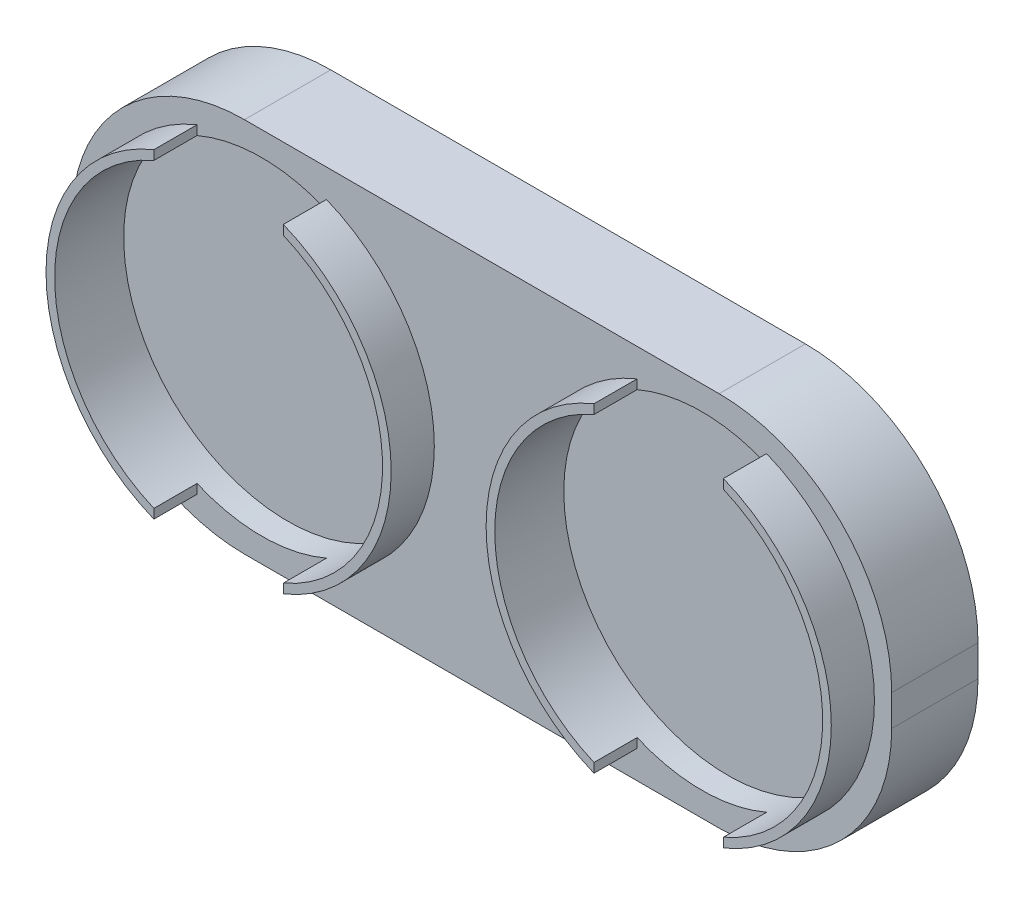
ISO-10303-21;
HEADER;
FILE_DESCRIPTION(('STEP AP214'),'2;1');
FILE_NAME('part.step','',(''),(''),'','','');
FILE_SCHEMA(('AUTOMOTIVE_DESIGN { 1 0 10303 214 1 1 1 1 }'));
ENDSEC;
DATA;
#1=APPLICATION_CONTEXT('core data for automotive mechanical design processes');
#2=APPLICATION_PROTOCOL_DEFINITION('international standard','automotive_design',2000,#1);
#3=PRODUCT_CONTEXT('',#1,'mechanical');
#4=PRODUCT('Part','Part','',(#3));
#5=PRODUCT_RELATED_PRODUCT_CATEGORY('part','',(#4));
#6=PRODUCT_DEFINITION_FORMATION('','',#4);
#7=PRODUCT_DEFINITION_CONTEXT('part definition',#1,'design');
#8=PRODUCT_DEFINITION('design','',#6,#7);
#9=PRODUCT_DEFINITION_SHAPE('','',#8);
#10=(LENGTH_UNIT() NAMED_UNIT(*) SI_UNIT(.MILLI.,.METRE.));
#11=(NAMED_UNIT(*) PLANE_ANGLE_UNIT() SI_UNIT($,.RADIAN.));
#12=(NAMED_UNIT(*) SI_UNIT($,.STERADIAN.) SOLID_ANGLE_UNIT());
#13=UNCERTAINTY_MEASURE_WITH_UNIT(LENGTH_MEASURE(1.E-05),#10,'distance_accuracy_value','');
#14=(GEOMETRIC_REPRESENTATION_CONTEXT(3) GLOBAL_UNCERTAINTY_ASSIGNED_CONTEXT((#13)) GLOBAL_UNIT_ASSIGNED_CONTEXT((#10,
#11,#12)) REPRESENTATION_CONTEXT('',''));
#15=CARTESIAN_POINT('',(0.,0.,0.));
#16=DIRECTION('',(0.,0.,1.));
#17=DIRECTION('',(1.,0.,0.));
#18=AXIS2_PLACEMENT_3D('',#15,#16,#17);
#19=CARTESIAN_POINT('',(0.,0.,0.));
#20=DIRECTION('',(0.,0.,-1.));
#21=DIRECTION('',(-1.,0.,0.));
#22=AXIS2_PLACEMENT_3D('',#19,#20,#21);
#23=PLANE('',#22);
#24=CARTESIAN_POINT('',(-24.87,-12.45,0.));
#25=DIRECTION('',(0.,0.,-1.));
#26=DIRECTION('',(-1.,0.,0.));
#27=AXIS2_PLACEMENT_3D('',#24,#25,#26);
#28=CIRCLE('',#27,3.9);
#29=CARTESIAN_POINT('',(-28.77,-12.45,0.));
#30=VERTEX_POINT('',#29);
#31=EDGE_CURVE('E937',#30,#30,#28,.T.);
#32=ORIENTED_EDGE('',*,*,#31,.F.);
#33=EDGE_LOOP('',(#32));
#34=FACE_BOUND('',#33,.T.);
#35=CARTESIAN_POINT('',(24.87,-12.45,0.));
#36=DIRECTION('',(0.,0.,-1.));
#37=DIRECTION('',(-1.,0.,0.));
#38=AXIS2_PLACEMENT_3D('',#35,#36,#37);
#39=CIRCLE('',#38,3.9);
#40=CARTESIAN_POINT('',(20.97,-12.45,0.));
#41=VERTEX_POINT('',#40);
#42=EDGE_CURVE('E928',#41,#41,#39,.T.);
#43=ORIENTED_EDGE('',*,*,#42,.F.);
#44=EDGE_LOOP('',(#43));
#45=FACE_BOUND('',#44,.T.);
#46=CARTESIAN_POINT('',(0.,12.45,0.));
#47=DIRECTION('',(0.,0.,-1.));
#48=DIRECTION('',(-1.,0.,0.));
#49=AXIS2_PLACEMENT_3D('',#46,#47,#48);
#50=CIRCLE('',#49,3.9);
#51=CARTESIAN_POINT('',(-3.9,12.45,0.));
#52=VERTEX_POINT('',#51);
#53=EDGE_CURVE('E271',#52,#52,#50,.F.);
#54=ORIENTED_EDGE('',*,*,#53,.T.);
#55=EDGE_LOOP('',(#54));
#56=FACE_BOUND('',#55,.T.);
#57=DIRECTION('',(0.,-1.,0.));
#58=VECTOR('',#57,1.);
#59=CARTESIAN_POINT('',(-47.5,-21.8,0.));
#60=LINE('',#59,#58);
#61=CARTESIAN_POINT('',(-47.5,1.8,0.));
#62=VERTEX_POINT('',#61);
#63=CARTESIAN_POINT('',(-47.5,-1.8,0.));
#64=VERTEX_POINT('',#63);
#65=EDGE_CURVE('E288',#62,#64,#60,.T.);
#66=ORIENTED_EDGE('',*,*,#65,.F.);
#67=CARTESIAN_POINT('',(-27.5,1.8,0.));
#68=DIRECTION('',(0.,0.,-1.));
#69=DIRECTION('',(-1.,0.,0.));
#70=AXIS2_PLACEMENT_3D('',#67,#68,#69);
#71=CIRCLE('',#70,20.);
#72=CARTESIAN_POINT('',(-27.5,21.8,0.));
#73=VERTEX_POINT('',#72);
#74=EDGE_CURVE('E310',#62,#73,#71,.T.);
#75=ORIENTED_EDGE('',*,*,#74,.T.);
#76=DIRECTION('',(-1.,0.,0.));
#77=VECTOR('',#76,1.);
#78=CARTESIAN_POINT('',(47.5,21.8,0.));
#79=LINE('',#78,#77);
#80=CARTESIAN_POINT('',(27.5,21.8,0.));
#81=VERTEX_POINT('',#80);
#82=EDGE_CURVE('E277',#81,#73,#79,.T.);
#83=ORIENTED_EDGE('',*,*,#82,.F.);
#84=CARTESIAN_POINT('',(27.5,1.8,0.));
#85=DIRECTION('',(0.,0.,-1.));
#86=DIRECTION('',(-1.,0.,0.));
#87=AXIS2_PLACEMENT_3D('',#84,#85,#86);
#88=CIRCLE('',#87,20.);
#89=CARTESIAN_POINT('',(47.5,1.8,0.));
#90=VERTEX_POINT('',#89);
#91=EDGE_CURVE('E301',#81,#90,#88,.T.);
#92=ORIENTED_EDGE('',*,*,#91,.T.);
#93=DIRECTION('',(0.,1.,0.));
#94=VECTOR('',#93,1.);
#95=CARTESIAN_POINT('',(47.5,-21.8,0.));
#96=LINE('',#95,#94);
#97=CARTESIAN_POINT('',(47.5,-1.8,0.));
#98=VERTEX_POINT('',#97);
#99=EDGE_CURVE('E282',#98,#90,#96,.T.);
#100=ORIENTED_EDGE('',*,*,#99,.F.);
#101=CARTESIAN_POINT('',(27.5,-1.8,0.));
#102=DIRECTION('',(0.,0.,-1.));
#103=DIRECTION('',(-1.,0.,0.));
#104=AXIS2_PLACEMENT_3D('',#101,#102,#103);
#105=CIRCLE('',#104,20.);
#106=CARTESIAN_POINT('',(27.5,-21.8,0.));
#107=VERTEX_POINT('',#106);
#108=EDGE_CURVE('E303',#98,#107,#105,.T.);
#109=ORIENTED_EDGE('',*,*,#108,.T.);
#110=DIRECTION('',(1.,0.,0.));
#111=VECTOR('',#110,1.);
#112=CARTESIAN_POINT('',(47.5,-21.8,0.));
#113=LINE('',#112,#111);
#114=CARTESIAN_POINT('',(-27.5,-21.8,0.));
#115=VERTEX_POINT('',#114);
#116=EDGE_CURVE('E292',#115,#107,#113,.T.);
#117=ORIENTED_EDGE('',*,*,#116,.F.);
#118=CARTESIAN_POINT('',(-27.5,-1.8,0.));
#119=DIRECTION('',(0.,0.,-1.));
#120=DIRECTION('',(-1.,0.,0.));
#121=AXIS2_PLACEMENT_3D('',#118,#119,#120);
#122=CIRCLE('',#121,20.);
#123=EDGE_CURVE('E304',#115,#64,#122,.T.);
#124=ORIENTED_EDGE('',*,*,#123,.T.);
#125=EDGE_LOOP('',(#66,#75,#83,#92,#100,#109,#117,#124));
#126=FACE_BOUND('',#125,.T.);
#127=CARTESIAN_POINT('',(0.,-12.45,0.));
#128=DIRECTION('',(0.,0.,-1.));
#129=DIRECTION('',(-1.,0.,0.));
#130=AXIS2_PLACEMENT_3D('',#127,#128,#129);
#131=CIRCLE('',#130,3.9);
#132=CARTESIAN_POINT('',(-3.9,-12.45,0.));
#133=VERTEX_POINT('',#132);
#134=EDGE_CURVE('E258',#133,#133,#131,.T.);
#135=ORIENTED_EDGE('',*,*,#134,.F.);
#136=EDGE_LOOP('',(#135));
#137=FACE_BOUND('',#136,.T.);
#138=CARTESIAN_POINT('',(-24.87,12.45,0.));
#139=DIRECTION('',(0.,0.,-1.));
#140=DIRECTION('',(-1.,0.,0.));
#141=AXIS2_PLACEMENT_3D('',#138,#139,#140);
#142=CIRCLE('',#141,3.9);
#143=CARTESIAN_POINT('',(-28.77,12.45,0.));
#144=VERTEX_POINT('',#143);
#145=EDGE_CURVE('E328',#144,#144,#142,.T.);
#146=ORIENTED_EDGE('',*,*,#145,.F.);
#147=EDGE_LOOP('',(#146));
#148=FACE_BOUND('',#147,.T.);
#149=CARTESIAN_POINT('',(24.87,12.45,0.));
#150=DIRECTION('',(0.,0.,-1.));
#151=DIRECTION('',(-1.,0.,0.));
#152=AXIS2_PLACEMENT_3D('',#149,#150,#151);
#153=CIRCLE('',#152,3.9);
#154=CARTESIAN_POINT('',(20.97,12.45,0.));
#155=VERTEX_POINT('',#154);
#156=EDGE_CURVE('E332',#155,#155,#153,.T.);
#157=ORIENTED_EDGE('',*,*,#156,.F.);
#158=EDGE_LOOP('',(#157));
#159=FACE_BOUND('',#158,.T.);
#160=ADVANCED_FACE('F43',(#34,#45,#56,#126,#137,#148,#159),#23,.T.);
#161=CARTESIAN_POINT('',(0.,0.,10.));
#162=DIRECTION('',(0.,0.,-1.));
#163=DIRECTION('',(-1.,0.,0.));
#164=AXIS2_PLACEMENT_3D('',#161,#162,#163);
#165=PLANE('',#164);
#166=CARTESIAN_POINT('',(25.5,0.,10.));
#167=DIRECTION('',(0.,0.,1.));
#168=DIRECTION('',(-1.,0.,0.));
#169=AXIS2_PLACEMENT_3D('',#166,#167,#168);
#170=CIRCLE('',#169,19.);
#171=CARTESIAN_POINT('',(18.,-17.4570902500961,10.));
#172=VERTEX_POINT('',#171);
#173=CARTESIAN_POINT('',(33.,-17.4570902500961,10.));
#174=VERTEX_POINT('',#173);
#175=EDGE_CURVE('E207',#172,#174,#170,.T.);
#176=ORIENTED_EDGE('',*,*,#175,.F.);
#177=DIRECTION('',(0.,-1.,0.));
#178=VECTOR('',#177,1.);
#179=CARTESIAN_POINT('',(18.,-21.8,10.));
#180=LINE('',#179,#178);
#181=CARTESIAN_POINT('',(18.,-18.5404962177391,10.));
#182=VERTEX_POINT('',#181);
#183=EDGE_CURVE('E208',#172,#182,#180,.T.);
#184=ORIENTED_EDGE('',*,*,#183,.T.);
#185=CARTESIAN_POINT('',(25.5,0.,10.));
#186=DIRECTION('',(0.,0.,1.));
#187=DIRECTION('',(1.,0.,0.));
#188=AXIS2_PLACEMENT_3D('',#185,#186,#187);
#189=CIRCLE('',#188,20.);
#190=CARTESIAN_POINT('',(18.,18.5404962177392,10.));
#191=VERTEX_POINT('',#190);
#192=EDGE_CURVE('E263',#182,#191,#189,.F.);
#193=ORIENTED_EDGE('',*,*,#192,.T.);
#194=CARTESIAN_POINT('',(18.,17.4570902500961,10.));
#195=VERTEX_POINT('',#194);
#196=EDGE_CURVE('E227',#191,#195,#180,.T.);
#197=ORIENTED_EDGE('',*,*,#196,.T.);
#198=CARTESIAN_POINT('',(33.,17.4570902500961,10.));
#199=VERTEX_POINT('',#198);
#200=EDGE_CURVE('E216',#199,#195,#170,.T.);
#201=ORIENTED_EDGE('',*,*,#200,.F.);
#202=DIRECTION('',(0.,1.,0.));
#203=VECTOR('',#202,1.);
#204=CARTESIAN_POINT('',(33.,-21.8,10.));
#205=LINE('',#204,#203);
#206=CARTESIAN_POINT('',(33.,18.5404962177392,10.));
#207=VERTEX_POINT('',#206);
#208=EDGE_CURVE('E909',#199,#207,#205,.T.);
#209=ORIENTED_EDGE('',*,*,#208,.T.);
#210=CARTESIAN_POINT('',(33.,-18.5404962177392,10.));
#211=VERTEX_POINT('',#210);
#212=EDGE_CURVE('E250',#207,#211,#189,.F.);
#213=ORIENTED_EDGE('',*,*,#212,.T.);
#214=EDGE_CURVE('E214',#211,#174,#205,.T.);
#215=ORIENTED_EDGE('',*,*,#214,.T.);
#216=EDGE_LOOP('',(#176,#184,#193,#197,#201,#209,#213,#215));
#217=FACE_BOUND('',#216,.T.);
#218=DIRECTION('',(-1.,0.,0.));
#219=VECTOR('',#218,1.);
#220=CARTESIAN_POINT('',(47.5,21.8,10.));
#221=LINE('',#220,#219);
#222=CARTESIAN_POINT('',(27.5,21.8,10.));
#223=VERTEX_POINT('',#222);
#224=CARTESIAN_POINT('',(-27.5,21.8,10.));
#225=VERTEX_POINT('',#224);
#226=EDGE_CURVE('E280',#223,#225,#221,.T.);
#227=ORIENTED_EDGE('',*,*,#226,.T.);
#228=CARTESIAN_POINT('',(-27.5,1.8,10.));
#229=DIRECTION('',(0.,0.,-1.));
#230=DIRECTION('',(-1.,0.,0.));
#231=AXIS2_PLACEMENT_3D('',#228,#229,#230);
#232=CIRCLE('',#231,20.);
#233=CARTESIAN_POINT('',(-47.5,1.8,10.));
#234=VERTEX_POINT('',#233);
#235=EDGE_CURVE('E316',#225,#234,#232,.F.);
#236=ORIENTED_EDGE('',*,*,#235,.T.);
#237=DIRECTION('',(0.,-1.,0.));
#238=VECTOR('',#237,1.);
#239=CARTESIAN_POINT('',(-47.5,-21.8,10.));
#240=LINE('',#239,#238);
#241=CARTESIAN_POINT('',(-47.5,-1.8,10.));
#242=VERTEX_POINT('',#241);
#243=EDGE_CURVE('E278',#234,#242,#240,.T.);
#244=ORIENTED_EDGE('',*,*,#243,.T.);
#245=CARTESIAN_POINT('',(-27.5,-1.8,10.));
#246=DIRECTION('',(0.,0.,-1.));
#247=DIRECTION('',(-1.,0.,0.));
#248=AXIS2_PLACEMENT_3D('',#245,#246,#247);
#249=CIRCLE('',#248,20.);
#250=CARTESIAN_POINT('',(-27.5,-21.8,10.));
#251=VERTEX_POINT('',#250);
#252=EDGE_CURVE('E320',#242,#251,#249,.F.);
#253=ORIENTED_EDGE('',*,*,#252,.T.);
#254=DIRECTION('',(1.,0.,0.));
#255=VECTOR('',#254,1.);
#256=CARTESIAN_POINT('',(47.5,-21.8,10.));
#257=LINE('',#256,#255);
#258=CARTESIAN_POINT('',(27.5,-21.8,10.));
#259=VERTEX_POINT('',#258);
#260=EDGE_CURVE('E281',#251,#259,#257,.T.);
#261=ORIENTED_EDGE('',*,*,#260,.T.);
#262=CARTESIAN_POINT('',(27.5,-1.8,10.));
#263=DIRECTION('',(0.,0.,-1.));
#264=DIRECTION('',(-1.,0.,0.));
#265=AXIS2_PLACEMENT_3D('',#262,#263,#264);
#266=CIRCLE('',#265,20.);
#267=CARTESIAN_POINT('',(47.5,-1.8,10.));
#268=VERTEX_POINT('',#267);
#269=EDGE_CURVE('E63',#259,#268,#266,.F.);
#270=ORIENTED_EDGE('',*,*,#269,.T.);
#271=DIRECTION('',(0.,1.,0.));
#272=VECTOR('',#271,1.);
#273=CARTESIAN_POINT('',(47.5,-21.8,10.));
#274=LINE('',#273,#272);
#275=CARTESIAN_POINT('',(47.5,1.8,10.));
#276=VERTEX_POINT('',#275);
#277=EDGE_CURVE('E275',#268,#276,#274,.T.);
#278=ORIENTED_EDGE('',*,*,#277,.T.);
#279=CARTESIAN_POINT('',(27.5,1.8,10.));
#280=DIRECTION('',(0.,0.,-1.));
#281=DIRECTION('',(-1.,0.,0.));
#282=AXIS2_PLACEMENT_3D('',#279,#280,#281);
#283=CIRCLE('',#282,20.);
#284=EDGE_CURVE('E313',#276,#223,#283,.F.);
#285=ORIENTED_EDGE('',*,*,#284,.T.);
#286=EDGE_LOOP('',(#227,#236,#244,#253,#261,#270,#278,#285));
#287=FACE_BOUND('',#286,.T.);
#288=CARTESIAN_POINT('',(-25.5,0.,10.));
#289=DIRECTION('',(0.,0.,1.));
#290=DIRECTION('',(1.,0.,0.));
#291=AXIS2_PLACEMENT_3D('',#288,#289,#290);
#292=CIRCLE('',#291,19.);
#293=CARTESIAN_POINT('',(-18.,17.4570902500961,10.));
#294=VERTEX_POINT('',#293);
#295=CARTESIAN_POINT('',(-33.,17.4570902500961,10.));
#296=VERTEX_POINT('',#295);
#297=EDGE_CURVE('E934',#294,#296,#292,.T.);
#298=ORIENTED_EDGE('',*,*,#297,.F.);
#299=DIRECTION('',(0.,1.,0.));
#300=VECTOR('',#299,1.);
#301=CARTESIAN_POINT('',(-18.,-21.8,10.));
#302=LINE('',#301,#300);
#303=CARTESIAN_POINT('',(-18.,18.5404962177392,10.));
#304=VERTEX_POINT('',#303);
#305=EDGE_CURVE('E885',#294,#304,#302,.T.);
#306=ORIENTED_EDGE('',*,*,#305,.T.);
#307=CARTESIAN_POINT('',(-25.5,0.,10.));
#308=DIRECTION('',(0.,0.,1.));
#309=DIRECTION('',(1.,0.,0.));
#310=AXIS2_PLACEMENT_3D('',#307,#308,#309);
#311=CIRCLE('',#310,20.);
#312=CARTESIAN_POINT('',(-18.,-18.5404962177392,10.));
#313=VERTEX_POINT('',#312);
#314=EDGE_CURVE('E257',#313,#304,#311,.T.);
#315=ORIENTED_EDGE('',*,*,#314,.F.);
#316=CARTESIAN_POINT('',(-18.,-17.4570902500961,10.));
#317=VERTEX_POINT('',#316);
#318=EDGE_CURVE('E877',#313,#317,#302,.T.);
#319=ORIENTED_EDGE('',*,*,#318,.T.);
#320=CARTESIAN_POINT('',(-33.,-17.4570902500961,10.));
#321=VERTEX_POINT('',#320);
#322=EDGE_CURVE('E220',#321,#317,#292,.T.);
#323=ORIENTED_EDGE('',*,*,#322,.F.);
#324=DIRECTION('',(0.,-1.,0.));
#325=VECTOR('',#324,1.);
#326=CARTESIAN_POINT('',(-33.,-21.8,10.));
#327=LINE('',#326,#325);
#328=CARTESIAN_POINT('',(-33.,-18.5404962177392,10.));
#329=VERTEX_POINT('',#328);
#330=EDGE_CURVE('E925',#321,#329,#327,.T.);
#331=ORIENTED_EDGE('',*,*,#330,.T.);
#332=CARTESIAN_POINT('',(-33.,18.5404962177392,10.));
#333=VERTEX_POINT('',#332);
#334=EDGE_CURVE('E256',#333,#329,#311,.T.);
#335=ORIENTED_EDGE('',*,*,#334,.F.);
#336=EDGE_CURVE('E924',#333,#296,#327,.T.);
#337=ORIENTED_EDGE('',*,*,#336,.T.);
#338=EDGE_LOOP('',(#298,#306,#315,#319,#323,#331,#335,#337));
#339=FACE_BOUND('',#338,.T.);
#340=ADVANCED_FACE('F206',(#217,#287,#339),#165,.F.);
#341=CARTESIAN_POINT('',(25.5,0.,15.));
#342=DIRECTION('',(0.,0.,-1.));
#343=DIRECTION('',(-1.,0.,0.));
#344=AXIS2_PLACEMENT_3D('',#341,#342,#343);
#345=CYLINDRICAL_SURFACE('',#344,20.);
#346=DIRECTION('',(0.,0.,-1.));
#347=VECTOR('',#346,1.);
#348=CARTESIAN_POINT('',(18.,18.5404962177392,15.));
#349=LINE('',#348,#347);
#350=CARTESIAN_POINT('',(18.,18.5404962177392,15.));
#351=VERTEX_POINT('',#350);
#352=EDGE_CURVE('E244',#191,#351,#349,.F.);
#353=ORIENTED_EDGE('',*,*,#352,.F.);
#354=ORIENTED_EDGE('',*,*,#192,.F.);
#355=DIRECTION('',(0.,0.,-1.));
#356=VECTOR('',#355,1.);
#357=CARTESIAN_POINT('',(18.,-18.5404962177391,15.));
#358=LINE('',#357,#356);
#359=CARTESIAN_POINT('',(18.,-18.5404962177391,15.));
#360=VERTEX_POINT('',#359);
#361=EDGE_CURVE('E228',#360,#182,#358,.T.);
#362=ORIENTED_EDGE('',*,*,#361,.F.);
#363=CARTESIAN_POINT('',(25.5,0.,15.));
#364=DIRECTION('',(0.,0.,1.));
#365=DIRECTION('',(1.,0.,0.));
#366=AXIS2_PLACEMENT_3D('',#363,#364,#365);
#367=CIRCLE('',#366,20.);
#368=EDGE_CURVE('E261',#360,#351,#367,.F.);
#369=ORIENTED_EDGE('',*,*,#368,.T.);
#370=EDGE_LOOP('',(#353,#354,#362,#369));
#371=FACE_BOUND('',#370,.T.);
#372=ADVANCED_FACE('F390',(#371),#345,.T.);
#373=CARTESIAN_POINT('',(0.,0.,15.));
#374=DIRECTION('',(0.,0.,1.));
#375=DIRECTION('',(1.,0.,0.));
#376=AXIS2_PLACEMENT_3D('',#373,#374,#375);
#377=PLANE('',#376);
#378=DIRECTION('',(0.,1.,0.));
#379=VECTOR('',#378,1.);
#380=CARTESIAN_POINT('',(33.,-21.8,15.));
#381=LINE('',#380,#379);
#382=CARTESIAN_POINT('',(33.,-18.5404962177392,15.));
#383=VERTEX_POINT('',#382);
#384=CARTESIAN_POINT('',(33.,-17.4570902500961,15.));
#385=VERTEX_POINT('',#384);
#386=EDGE_CURVE('E917',#383,#385,#381,.T.);
#387=ORIENTED_EDGE('',*,*,#386,.F.);
#388=CARTESIAN_POINT('',(33.,18.5404962177392,15.));
#389=VERTEX_POINT('',#388);
#390=EDGE_CURVE('E262',#389,#383,#367,.F.);
#391=ORIENTED_EDGE('',*,*,#390,.F.);
#392=CARTESIAN_POINT('',(33.,17.4570902500961,15.));
#393=VERTEX_POINT('',#392);
#394=EDGE_CURVE('E908',#393,#389,#381,.T.);
#395=ORIENTED_EDGE('',*,*,#394,.F.);
#396=CARTESIAN_POINT('',(25.5,0.,15.));
#397=DIRECTION('',(0.,0.,1.));
#398=DIRECTION('',(1.,0.,0.));
#399=AXIS2_PLACEMENT_3D('',#396,#397,#398);
#400=CIRCLE('',#399,19.);
#401=EDGE_CURVE('E266',#393,#385,#400,.F.);
#402=ORIENTED_EDGE('',*,*,#401,.T.);
#403=EDGE_LOOP('',(#387,#391,#395,#402));
#404=FACE_BOUND('',#403,.T.);
#405=ADVANCED_FACE('F513',(#404),#377,.T.);
#406=CARTESIAN_POINT('',(-25.5,0.,15.));
#407=DIRECTION('',(0.,0.,-1.));
#408=DIRECTION('',(-1.,0.,0.));
#409=AXIS2_PLACEMENT_3D('',#406,#407,#408);
#410=CYLINDRICAL_SURFACE('',#409,20.);
#411=CARTESIAN_POINT('',(-25.5,0.,15.));
#412=DIRECTION('',(0.,0.,1.));
#413=DIRECTION('',(1.,0.,0.));
#414=AXIS2_PLACEMENT_3D('',#411,#412,#413);
#415=CIRCLE('',#414,20.);
#416=CARTESIAN_POINT('',(-33.,18.5404962177392,15.));
#417=VERTEX_POINT('',#416);
#418=CARTESIAN_POINT('',(-33.,-18.5404962177392,15.));
#419=VERTEX_POINT('',#418);
#420=EDGE_CURVE('E253',#417,#419,#415,.T.);
#421=ORIENTED_EDGE('',*,*,#420,.F.);
#422=DIRECTION('',(0.,0.,-1.));
#423=VECTOR('',#422,1.);
#424=CARTESIAN_POINT('',(-33.,18.5404962177392,15.));
#425=LINE('',#424,#423);
#426=EDGE_CURVE('E892',#417,#333,#425,.T.);
#427=ORIENTED_EDGE('',*,*,#426,.T.);
#428=ORIENTED_EDGE('',*,*,#334,.T.);
#429=DIRECTION('',(0.,0.,-1.));
#430=VECTOR('',#429,1.);
#431=CARTESIAN_POINT('',(-33.,-18.5404962177392,15.));
#432=LINE('',#431,#430);
#433=EDGE_CURVE('E891',#329,#419,#432,.F.);
#434=ORIENTED_EDGE('',*,*,#433,.T.);
#435=EDGE_LOOP('',(#421,#427,#428,#434));
#436=FACE_BOUND('',#435,.T.);
#437=ADVANCED_FACE('F510',(#436),#410,.T.);
#438=CARTESIAN_POINT('',(0.,0.,15.));
#439=DIRECTION('',(0.,0.,1.));
#440=DIRECTION('',(1.,0.,0.));
#441=AXIS2_PLACEMENT_3D('',#438,#439,#440);
#442=PLANE('',#441);
#443=DIRECTION('',(0.,1.,0.));
#444=VECTOR('',#443,1.);
#445=CARTESIAN_POINT('',(-18.,-21.8,15.));
#446=LINE('',#445,#444);
#447=CARTESIAN_POINT('',(-18.,-18.5404962177392,15.));
#448=VERTEX_POINT('',#447);
#449=CARTESIAN_POINT('',(-18.,-17.4570902500961,15.));
#450=VERTEX_POINT('',#449);
#451=EDGE_CURVE('E865',#448,#450,#446,.T.);
#452=ORIENTED_EDGE('',*,*,#451,.F.);
#453=CARTESIAN_POINT('',(-18.,18.5404962177392,15.));
#454=VERTEX_POINT('',#453);
#455=EDGE_CURVE('E255',#448,#454,#415,.T.);
#456=ORIENTED_EDGE('',*,*,#455,.T.);
#457=CARTESIAN_POINT('',(-18.,17.4570902500961,15.));
#458=VERTEX_POINT('',#457);
#459=EDGE_CURVE('E870',#458,#454,#446,.T.);
#460=ORIENTED_EDGE('',*,*,#459,.F.);
#461=CARTESIAN_POINT('',(-25.5,0.,15.));
#462=DIRECTION('',(0.,0.,1.));
#463=DIRECTION('',(1.,0.,0.));
#464=AXIS2_PLACEMENT_3D('',#461,#462,#463);
#465=CIRCLE('',#464,19.);
#466=EDGE_CURVE('E247',#450,#458,#465,.T.);
#467=ORIENTED_EDGE('',*,*,#466,.F.);
#468=EDGE_LOOP('',(#452,#456,#460,#467));
#469=FACE_BOUND('',#468,.T.);
#470=ADVANCED_FACE('F409',(#469),#442,.T.);
#471=CARTESIAN_POINT('',(47.5,21.8,10.));
#472=DIRECTION('',(0.,-1.,0.));
#473=DIRECTION('',(0.,0.,-1.));
#474=AXIS2_PLACEMENT_3D('',#471,#472,#473);
#475=PLANE('',#474);
#476=ORIENTED_EDGE('',*,*,#82,.T.);
#477=DIRECTION('',(0.,0.,-1.));
#478=VECTOR('',#477,1.);
#479=CARTESIAN_POINT('',(-27.5,21.8,10.));
#480=LINE('',#479,#478);
#481=EDGE_CURVE('E315',#73,#225,#480,.F.);
#482=ORIENTED_EDGE('',*,*,#481,.T.);
#483=ORIENTED_EDGE('',*,*,#226,.F.);
#484=DIRECTION('',(0.,0.,-1.));
#485=VECTOR('',#484,1.);
#486=CARTESIAN_POINT('',(27.5,21.8,10.));
#487=LINE('',#486,#485);
#488=EDGE_CURVE('E307',#223,#81,#487,.T.);
#489=ORIENTED_EDGE('',*,*,#488,.T.);
#490=EDGE_LOOP('',(#476,#482,#483,#489));
#491=FACE_BOUND('',#490,.T.);
#492=ADVANCED_FACE('F404',(#491),#475,.F.);
#493=CARTESIAN_POINT('',(-47.5,-21.8,10.));
#494=DIRECTION('',(1.,0.,0.));
#495=DIRECTION('',(0.,0.,-1.));
#496=AXIS2_PLACEMENT_3D('',#493,#494,#495);
#497=PLANE('',#496);
#498=ORIENTED_EDGE('',*,*,#243,.F.);
#499=DIRECTION('',(0.,0.,-1.));
#500=VECTOR('',#499,1.);
#501=CARTESIAN_POINT('',(-47.5,1.8,10.));
#502=LINE('',#501,#500);
#503=EDGE_CURVE('E296',#234,#62,#502,.T.);
#504=ORIENTED_EDGE('',*,*,#503,.T.);
#505=ORIENTED_EDGE('',*,*,#65,.T.);
#506=DIRECTION('',(0.,0.,-1.));
#507=VECTOR('',#506,1.);
#508=CARTESIAN_POINT('',(-47.5,-1.8,10.));
#509=LINE('',#508,#507);
#510=EDGE_CURVE('E298',#64,#242,#509,.F.);
#511=ORIENTED_EDGE('',*,*,#510,.T.);
#512=EDGE_LOOP('',(#498,#504,#505,#511));
#513=FACE_BOUND('',#512,.T.);
#514=ADVANCED_FACE('F399',(#513),#497,.F.);
#515=CARTESIAN_POINT('',(47.5,-21.8,10.));
#516=DIRECTION('',(0.,1.,0.));
#517=DIRECTION('',(0.,0.,1.));
#518=AXIS2_PLACEMENT_3D('',#515,#516,#517);
#519=PLANE('',#518);
#520=ORIENTED_EDGE('',*,*,#260,.F.);
#521=DIRECTION('',(0.,0.,-1.));
#522=VECTOR('',#521,1.);
#523=CARTESIAN_POINT('',(-27.5,-21.8,10.));
#524=LINE('',#523,#522);
#525=EDGE_CURVE('E324',#251,#115,#524,.T.);
#526=ORIENTED_EDGE('',*,*,#525,.T.);
#527=ORIENTED_EDGE('',*,*,#116,.T.);
#528=DIRECTION('',(0.,0.,-1.));
#529=VECTOR('',#528,1.);
#530=CARTESIAN_POINT('',(27.5,-21.8,10.));
#531=LINE('',#530,#529);
#532=EDGE_CURVE('E322',#107,#259,#531,.F.);
#533=ORIENTED_EDGE('',*,*,#532,.T.);
#534=EDGE_LOOP('',(#520,#526,#527,#533));
#535=FACE_BOUND('',#534,.T.);
#536=ADVANCED_FACE('F400',(#535),#519,.F.);
#537=CARTESIAN_POINT('',(47.5,-21.8,10.));
#538=DIRECTION('',(-1.,0.,0.));
#539=DIRECTION('',(0.,0.,1.));
#540=AXIS2_PLACEMENT_3D('',#537,#538,#539);
#541=PLANE('',#540);
#542=ORIENTED_EDGE('',*,*,#277,.F.);
#543=DIRECTION('',(0.,0.,-1.));
#544=VECTOR('',#543,1.);
#545=CARTESIAN_POINT('',(47.5,-1.8,10.));
#546=LINE('',#545,#544);
#547=EDGE_CURVE('E329',#268,#98,#546,.T.);
#548=ORIENTED_EDGE('',*,*,#547,.T.);
#549=ORIENTED_EDGE('',*,*,#99,.T.);
#550=DIRECTION('',(0.,0.,-1.));
#551=VECTOR('',#550,1.);
#552=CARTESIAN_POINT('',(47.5,1.8,10.));
#553=LINE('',#552,#551);
#554=EDGE_CURVE('E59',#90,#276,#553,.F.);
#555=ORIENTED_EDGE('',*,*,#554,.T.);
#556=EDGE_LOOP('',(#542,#548,#549,#555));
#557=FACE_BOUND('',#556,.T.);
#558=ADVANCED_FACE('F395',(#557),#541,.F.);
#559=CARTESIAN_POINT('',(0.,12.45,-4.));
#560=DIRECTION('',(0.,0.,1.));
#561=DIRECTION('',(1.,0.,0.));
#562=AXIS2_PLACEMENT_3D('',#559,#560,#561);
#563=CYLINDRICAL_SURFACE('',#562,3.9);
#564=CARTESIAN_POINT('',(0.,12.45,-3.6));
#565=DIRECTION('',(0.,0.,-1.));
#566=DIRECTION('',(-1.,0.,0.));
#567=AXIS2_PLACEMENT_3D('',#564,#565,#566);
#568=CIRCLE('',#567,3.9);
#569=CARTESIAN_POINT('',(-3.9,12.45,-3.6));
#570=VERTEX_POINT('',#569);
#571=EDGE_CURVE('E359',#570,#570,#568,.F.);
#572=ORIENTED_EDGE('',*,*,#571,.T.);
#573=EDGE_LOOP('',(#572));
#574=FACE_BOUND('',#573,.T.);
#575=ORIENTED_EDGE('',*,*,#53,.F.);
#576=EDGE_LOOP('',(#575));
#577=FACE_BOUND('',#576,.T.);
#578=ADVANCED_FACE('F396',(#574,#577),#563,.T.);
#579=CARTESIAN_POINT('',(0.,0.,-4.));
#580=DIRECTION('',(0.,0.,-1.));
#581=DIRECTION('',(-1.,0.,0.));
#582=AXIS2_PLACEMENT_3D('',#579,#580,#581);
#583=PLANE('',#582);
#584=CARTESIAN_POINT('',(0.,12.45,-4.));
#585=DIRECTION('',(0.,0.,-1.));
#586=DIRECTION('',(-1.,0.,0.));
#587=AXIS2_PLACEMENT_3D('',#584,#585,#586);
#588=CIRCLE('',#587,3.5);
#589=CARTESIAN_POINT('',(-3.5,12.45,-4.));
#590=VERTEX_POINT('',#589);
#591=EDGE_CURVE('E361',#590,#590,#588,.T.);
#592=ORIENTED_EDGE('',*,*,#591,.T.);
#593=EDGE_LOOP('',(#592));
#594=FACE_BOUND('',#593,.T.);
#595=ADVANCED_FACE('F530',(#594),#583,.T.);
#596=CARTESIAN_POINT('',(0.,-12.45,-4.));
#597=DIRECTION('',(0.,0.,1.));
#598=DIRECTION('',(1.,0.,0.));
#599=AXIS2_PLACEMENT_3D('',#596,#597,#598);
#600=CYLINDRICAL_SURFACE('',#599,3.9);
#601=CARTESIAN_POINT('',(0.,-12.45,-3.6));
#602=DIRECTION('',(0.,0.,-1.));
#603=DIRECTION('',(-1.,0.,0.));
#604=AXIS2_PLACEMENT_3D('',#601,#602,#603);
#605=CIRCLE('',#604,3.9);
#606=CARTESIAN_POINT('',(-3.9,-12.45,-3.6));
#607=VERTEX_POINT('',#606);
#608=EDGE_CURVE('E11',#607,#607,#605,.F.);
#609=ORIENTED_EDGE('',*,*,#608,.T.);
#610=EDGE_LOOP('',(#609));
#611=FACE_BOUND('',#610,.T.);
#612=ORIENTED_EDGE('',*,*,#134,.T.);
#613=EDGE_LOOP('',(#612));
#614=FACE_BOUND('',#613,.T.);
#615=ADVANCED_FACE('F521',(#611,#614),#600,.T.);
#616=CARTESIAN_POINT('',(0.,0.,-4.));
#617=DIRECTION('',(0.,0.,-1.));
#618=DIRECTION('',(-1.,0.,0.));
#619=AXIS2_PLACEMENT_3D('',#616,#617,#618);
#620=PLANE('',#619);
#621=CARTESIAN_POINT('',(0.,-12.45,-4.));
#622=DIRECTION('',(0.,0.,-1.));
#623=DIRECTION('',(-1.,0.,0.));
#624=AXIS2_PLACEMENT_3D('',#621,#622,#623);
#625=CIRCLE('',#624,3.5);
#626=CARTESIAN_POINT('',(-3.5,-12.45,-4.));
#627=VERTEX_POINT('',#626);
#628=EDGE_CURVE('E51',#627,#627,#625,.T.);
#629=ORIENTED_EDGE('',*,*,#628,.T.);
#630=EDGE_LOOP('',(#629));
#631=FACE_BOUND('',#630,.T.);
#632=ADVANCED_FACE('F368',(#631),#620,.T.);
#633=DIRECTION('',(0.,0.,-1.));
#634=VECTOR('',#633,1.);
#635=CARTESIAN_POINT('',(33.,-18.5404962177392,15.));
#636=LINE('',#635,#634);
#637=EDGE_CURVE('E240',#211,#383,#636,.F.);
#638=ORIENTED_EDGE('',*,*,#637,.F.);
#639=ORIENTED_EDGE('',*,*,#212,.F.);
#640=DIRECTION('',(0.,0.,-1.));
#641=VECTOR('',#640,1.);
#642=CARTESIAN_POINT('',(33.,18.5404962177392,15.));
#643=LINE('',#642,#641);
#644=EDGE_CURVE('E239',#389,#207,#643,.T.);
#645=ORIENTED_EDGE('',*,*,#644,.F.);
#646=ORIENTED_EDGE('',*,*,#390,.T.);
#647=EDGE_LOOP('',(#638,#639,#645,#646));
#648=FACE_BOUND('',#647,.T.);
#649=ADVANCED_FACE('F519',(#648),#345,.T.);
#650=CARTESIAN_POINT('',(25.5,0.,15.));
#651=DIRECTION('',(0.,0.,-1.));
#652=DIRECTION('',(-1.,0.,0.));
#653=AXIS2_PLACEMENT_3D('',#650,#651,#652);
#654=CYLINDRICAL_SURFACE('',#653,19.);
#655=DIRECTION('',(0.,0.,-1.));
#656=VECTOR('',#655,1.);
#657=CARTESIAN_POINT('',(33.,17.4570902500961,15.));
#658=LINE('',#657,#656);
#659=EDGE_CURVE('E905',#393,#199,#658,.T.);
#660=ORIENTED_EDGE('',*,*,#659,.T.);
#661=ORIENTED_EDGE('',*,*,#200,.T.);
#662=DIRECTION('',(0.,0.,-1.));
#663=VECTOR('',#662,1.);
#664=CARTESIAN_POINT('',(18.,17.4570902500961,15.));
#665=LINE('',#664,#663);
#666=CARTESIAN_POINT('',(18.,17.4570902500961,15.));
#667=VERTEX_POINT('',#666);
#668=EDGE_CURVE('E236',#195,#667,#665,.F.);
#669=ORIENTED_EDGE('',*,*,#668,.T.);
#670=CARTESIAN_POINT('',(18.,-17.4570902500961,15.));
#671=VERTEX_POINT('',#670);
#672=EDGE_CURVE('E232',#671,#667,#400,.F.);
#673=ORIENTED_EDGE('',*,*,#672,.F.);
#674=DIRECTION('',(0.,0.,-1.));
#675=VECTOR('',#674,1.);
#676=CARTESIAN_POINT('',(18.,-17.4570902500961,15.));
#677=LINE('',#676,#675);
#678=EDGE_CURVE('E222',#671,#172,#677,.T.);
#679=ORIENTED_EDGE('',*,*,#678,.T.);
#680=ORIENTED_EDGE('',*,*,#175,.T.);
#681=DIRECTION('',(0.,0.,-1.));
#682=VECTOR('',#681,1.);
#683=CARTESIAN_POINT('',(33.,-17.4570902500961,15.));
#684=LINE('',#683,#682);
#685=EDGE_CURVE('E901',#174,#385,#684,.F.);
#686=ORIENTED_EDGE('',*,*,#685,.T.);
#687=ORIENTED_EDGE('',*,*,#401,.F.);
#688=EDGE_LOOP('',(#660,#661,#669,#673,#679,#680,#686,#687));
#689=FACE_BOUND('',#688,.T.);
#690=CARTESIAN_POINT('',(25.5,0.,7.));
#691=DIRECTION('',(0.,0.,1.));
#692=DIRECTION('',(-1.,0.,0.));
#693=AXIS2_PLACEMENT_3D('',#690,#691,#692);
#694=CIRCLE('',#693,19.);
#695=CARTESIAN_POINT('',(6.5,0.,7.));
#696=VERTEX_POINT('',#695);
#697=EDGE_CURVE('E929',#696,#696,#694,.T.);
#698=ORIENTED_EDGE('',*,*,#697,.F.);
#699=EDGE_LOOP('',(#698));
#700=FACE_BOUND('',#699,.T.);
#701=ADVANCED_FACE('F233',(#689,#700),#654,.F.);
#702=DIRECTION('',(0.,-1.,0.));
#703=VECTOR('',#702,1.);
#704=CARTESIAN_POINT('',(18.,-21.8,15.));
#705=LINE('',#704,#703);
#706=EDGE_CURVE('E919',#351,#667,#705,.T.);
#707=ORIENTED_EDGE('',*,*,#706,.F.);
#708=ORIENTED_EDGE('',*,*,#368,.F.);
#709=EDGE_CURVE('E882',#671,#360,#705,.T.);
#710=ORIENTED_EDGE('',*,*,#709,.F.);
#711=ORIENTED_EDGE('',*,*,#672,.T.);
#712=EDGE_LOOP('',(#707,#708,#710,#711));
#713=FACE_BOUND('',#712,.T.);
#714=ADVANCED_FACE('F509',(#713),#377,.T.);
#715=CARTESIAN_POINT('',(-25.5,0.,15.));
#716=DIRECTION('',(0.,0.,-1.));
#717=DIRECTION('',(-1.,0.,0.));
#718=AXIS2_PLACEMENT_3D('',#715,#716,#717);
#719=CYLINDRICAL_SURFACE('',#718,19.);
#720=DIRECTION('',(0.,0.,-1.));
#721=VECTOR('',#720,1.);
#722=CARTESIAN_POINT('',(-18.,-17.4570902500961,15.));
#723=LINE('',#722,#721);
#724=EDGE_CURVE('E887',#450,#317,#723,.T.);
#725=ORIENTED_EDGE('',*,*,#724,.F.);
#726=ORIENTED_EDGE('',*,*,#466,.T.);
#727=DIRECTION('',(0.,0.,-1.));
#728=VECTOR('',#727,1.);
#729=CARTESIAN_POINT('',(-18.,17.4570902500961,15.));
#730=LINE('',#729,#728);
#731=EDGE_CURVE('E880',#294,#458,#730,.F.);
#732=ORIENTED_EDGE('',*,*,#731,.F.);
#733=ORIENTED_EDGE('',*,*,#297,.T.);
#734=DIRECTION('',(0.,0.,-1.));
#735=VECTOR('',#734,1.);
#736=CARTESIAN_POINT('',(-33.,17.4570902500961,15.));
#737=LINE('',#736,#735);
#738=CARTESIAN_POINT('',(-33.,17.4570902500961,15.));
#739=VERTEX_POINT('',#738);
#740=EDGE_CURVE('E898',#739,#296,#737,.T.);
#741=ORIENTED_EDGE('',*,*,#740,.F.);
#742=CARTESIAN_POINT('',(-33.,-17.4570902500961,15.));
#743=VERTEX_POINT('',#742);
#744=EDGE_CURVE('E252',#739,#743,#465,.T.);
#745=ORIENTED_EDGE('',*,*,#744,.T.);
#746=DIRECTION('',(0.,0.,-1.));
#747=VECTOR('',#746,1.);
#748=CARTESIAN_POINT('',(-33.,-17.4570902500961,15.));
#749=LINE('',#748,#747);
#750=EDGE_CURVE('E900',#321,#743,#749,.F.);
#751=ORIENTED_EDGE('',*,*,#750,.F.);
#752=ORIENTED_EDGE('',*,*,#322,.T.);
#753=EDGE_LOOP('',(#725,#726,#732,#733,#741,#745,#751,#752));
#754=FACE_BOUND('',#753,.T.);
#755=CARTESIAN_POINT('',(-25.5,0.,7.));
#756=DIRECTION('',(0.,0.,1.));
#757=DIRECTION('',(1.,0.,0.));
#758=AXIS2_PLACEMENT_3D('',#755,#756,#757);
#759=CIRCLE('',#758,19.);
#760=CARTESIAN_POINT('',(-6.50000000000001,0.,7.));
#761=VERTEX_POINT('',#760);
#762=EDGE_CURVE('E911',#761,#761,#759,.T.);
#763=ORIENTED_EDGE('',*,*,#762,.F.);
#764=EDGE_LOOP('',(#763));
#765=FACE_BOUND('',#764,.T.);
#766=ADVANCED_FACE('F504',(#754,#765),#719,.F.);
#767=ORIENTED_EDGE('',*,*,#455,.F.);
#768=DIRECTION('',(0.,0.,-1.));
#769=VECTOR('',#768,1.);
#770=CARTESIAN_POINT('',(-18.,-18.5404962177392,15.));
#771=LINE('',#770,#769);
#772=EDGE_CURVE('E875',#448,#313,#771,.T.);
#773=ORIENTED_EDGE('',*,*,#772,.T.);
#774=ORIENTED_EDGE('',*,*,#314,.T.);
#775=DIRECTION('',(0.,0.,-1.));
#776=VECTOR('',#775,1.);
#777=CARTESIAN_POINT('',(-18.,18.5404962177392,15.));
#778=LINE('',#777,#776);
#779=EDGE_CURVE('E873',#304,#454,#778,.F.);
#780=ORIENTED_EDGE('',*,*,#779,.T.);
#781=EDGE_LOOP('',(#767,#773,#774,#780));
#782=FACE_BOUND('',#781,.T.);
#783=ADVANCED_FACE('F501',(#782),#410,.T.);
#784=DIRECTION('',(0.,-1.,0.));
#785=VECTOR('',#784,1.);
#786=CARTESIAN_POINT('',(-33.,-21.8,15.));
#787=LINE('',#786,#785);
#788=EDGE_CURVE('E923',#417,#739,#787,.T.);
#789=ORIENTED_EDGE('',*,*,#788,.F.);
#790=ORIENTED_EDGE('',*,*,#420,.T.);
#791=EDGE_CURVE('E869',#743,#419,#787,.T.);
#792=ORIENTED_EDGE('',*,*,#791,.F.);
#793=ORIENTED_EDGE('',*,*,#744,.F.);
#794=EDGE_LOOP('',(#789,#790,#792,#793));
#795=FACE_BOUND('',#794,.T.);
#796=ADVANCED_FACE('F489',(#795),#442,.T.);
#797=CARTESIAN_POINT('',(-33.,-21.8,-36.108133772687));
#798=DIRECTION('',(-1.,0.,0.));
#799=DIRECTION('',(0.,0.,1.));
#800=AXIS2_PLACEMENT_3D('',#797,#798,#799);
#801=PLANE('',#800);
#802=ORIENTED_EDGE('',*,*,#740,.T.);
#803=ORIENTED_EDGE('',*,*,#336,.F.);
#804=ORIENTED_EDGE('',*,*,#426,.F.);
#805=ORIENTED_EDGE('',*,*,#788,.T.);
#806=EDGE_LOOP('',(#802,#803,#804,#805));
#807=FACE_BOUND('',#806,.T.);
#808=ADVANCED_FACE('F487',(#807),#801,.F.);
#809=CARTESIAN_POINT('',(-18.,-21.8,-36.108133772687));
#810=DIRECTION('',(1.,0.,0.));
#811=DIRECTION('',(0.,1.,0.));
#812=AXIS2_PLACEMENT_3D('',#809,#810,#811);
#813=PLANE('',#812);
#814=ORIENTED_EDGE('',*,*,#731,.T.);
#815=ORIENTED_EDGE('',*,*,#459,.T.);
#816=ORIENTED_EDGE('',*,*,#779,.F.);
#817=ORIENTED_EDGE('',*,*,#305,.F.);
#818=EDGE_LOOP('',(#814,#815,#816,#817));
#819=FACE_BOUND('',#818,.T.);
#820=ADVANCED_FACE('F488',(#819),#813,.F.);
#821=ORIENTED_EDGE('',*,*,#750,.T.);
#822=ORIENTED_EDGE('',*,*,#791,.T.);
#823=ORIENTED_EDGE('',*,*,#433,.F.);
#824=ORIENTED_EDGE('',*,*,#330,.F.);
#825=EDGE_LOOP('',(#821,#822,#823,#824));
#826=FACE_BOUND('',#825,.T.);
#827=ADVANCED_FACE('F483',(#826),#801,.F.);
#828=ORIENTED_EDGE('',*,*,#724,.T.);
#829=ORIENTED_EDGE('',*,*,#318,.F.);
#830=ORIENTED_EDGE('',*,*,#772,.F.);
#831=ORIENTED_EDGE('',*,*,#451,.T.);
#832=EDGE_LOOP('',(#828,#829,#830,#831));
#833=FACE_BOUND('',#832,.T.);
#834=ADVANCED_FACE('F478',(#833),#813,.F.);
#835=CARTESIAN_POINT('',(33.,-21.8,-36.108133772687));
#836=DIRECTION('',(1.,0.,0.));
#837=DIRECTION('',(0.,0.,-1.));
#838=AXIS2_PLACEMENT_3D('',#835,#836,#837);
#839=PLANE('',#838);
#840=ORIENTED_EDGE('',*,*,#644,.T.);
#841=ORIENTED_EDGE('',*,*,#208,.F.);
#842=ORIENTED_EDGE('',*,*,#659,.F.);
#843=ORIENTED_EDGE('',*,*,#394,.T.);
#844=EDGE_LOOP('',(#840,#841,#842,#843));
#845=FACE_BOUND('',#844,.T.);
#846=ADVANCED_FACE('F482',(#845),#839,.F.);
#847=CARTESIAN_POINT('',(18.,-21.8,-36.108133772687));
#848=DIRECTION('',(-1.,0.,0.));
#849=DIRECTION('',(0.,-1.,0.));
#850=AXIS2_PLACEMENT_3D('',#847,#848,#849);
#851=PLANE('',#850);
#852=ORIENTED_EDGE('',*,*,#352,.T.);
#853=ORIENTED_EDGE('',*,*,#706,.T.);
#854=ORIENTED_EDGE('',*,*,#668,.F.);
#855=ORIENTED_EDGE('',*,*,#196,.F.);
#856=EDGE_LOOP('',(#852,#853,#854,#855));
#857=FACE_BOUND('',#856,.T.);
#858=ADVANCED_FACE('F495',(#857),#851,.F.);
#859=ORIENTED_EDGE('',*,*,#361,.T.);
#860=ORIENTED_EDGE('',*,*,#183,.F.);
#861=ORIENTED_EDGE('',*,*,#678,.F.);
#862=ORIENTED_EDGE('',*,*,#709,.T.);
#863=EDGE_LOOP('',(#859,#860,#861,#862));
#864=FACE_BOUND('',#863,.T.);
#865=ADVANCED_FACE('F225',(#864),#851,.F.);
#866=ORIENTED_EDGE('',*,*,#637,.T.);
#867=ORIENTED_EDGE('',*,*,#386,.T.);
#868=ORIENTED_EDGE('',*,*,#685,.F.);
#869=ORIENTED_EDGE('',*,*,#214,.F.);
#870=EDGE_LOOP('',(#866,#867,#868,#869));
#871=FACE_BOUND('',#870,.T.);
#872=ADVANCED_FACE('F411',(#871),#839,.F.);
#873=CARTESIAN_POINT('',(-27.5,1.8,10.));
#874=DIRECTION('',(0.,0.,-1.));
#875=DIRECTION('',(-1.,0.,0.));
#876=AXIS2_PLACEMENT_3D('',#873,#874,#875);
#877=CYLINDRICAL_SURFACE('',#876,20.);
#878=ORIENTED_EDGE('',*,*,#235,.F.);
#879=ORIENTED_EDGE('',*,*,#481,.F.);
#880=ORIENTED_EDGE('',*,*,#74,.F.);
#881=ORIENTED_EDGE('',*,*,#503,.F.);
#882=EDGE_LOOP('',(#878,#879,#880,#881));
#883=FACE_BOUND('',#882,.T.);
#884=ADVANCED_FACE('F408',(#883),#877,.T.);
#885=CARTESIAN_POINT('',(-27.5,-1.8,10.));
#886=DIRECTION('',(0.,0.,-1.));
#887=DIRECTION('',(-1.,0.,0.));
#888=AXIS2_PLACEMENT_3D('',#885,#886,#887);
#889=CYLINDRICAL_SURFACE('',#888,20.);
#890=ORIENTED_EDGE('',*,*,#252,.F.);
#891=ORIENTED_EDGE('',*,*,#510,.F.);
#892=ORIENTED_EDGE('',*,*,#123,.F.);
#893=ORIENTED_EDGE('',*,*,#525,.F.);
#894=EDGE_LOOP('',(#890,#891,#892,#893));
#895=FACE_BOUND('',#894,.T.);
#896=ADVANCED_FACE('F415',(#895),#889,.T.);
#897=CARTESIAN_POINT('',(27.5,-1.8,10.));
#898=DIRECTION('',(0.,0.,-1.));
#899=DIRECTION('',(-1.,0.,0.));
#900=AXIS2_PLACEMENT_3D('',#897,#898,#899);
#901=CYLINDRICAL_SURFACE('',#900,20.);
#902=ORIENTED_EDGE('',*,*,#269,.F.);
#903=ORIENTED_EDGE('',*,*,#532,.F.);
#904=ORIENTED_EDGE('',*,*,#108,.F.);
#905=ORIENTED_EDGE('',*,*,#547,.F.);
#906=EDGE_LOOP('',(#902,#903,#904,#905));
#907=FACE_BOUND('',#906,.T.);
#908=ADVANCED_FACE('F417',(#907),#901,.T.);
#909=CARTESIAN_POINT('',(27.5,1.8,10.));
#910=DIRECTION('',(0.,0.,-1.));
#911=DIRECTION('',(-1.,0.,0.));
#912=AXIS2_PLACEMENT_3D('',#909,#910,#911);
#913=CYLINDRICAL_SURFACE('',#912,20.);
#914=ORIENTED_EDGE('',*,*,#284,.F.);
#915=ORIENTED_EDGE('',*,*,#554,.F.);
#916=ORIENTED_EDGE('',*,*,#91,.F.);
#917=ORIENTED_EDGE('',*,*,#488,.F.);
#918=EDGE_LOOP('',(#914,#915,#916,#917));
#919=FACE_BOUND('',#918,.T.);
#920=ADVANCED_FACE('F422',(#919),#913,.T.);
#921=CARTESIAN_POINT('',(25.5,0.,7.));
#922=DIRECTION('',(0.,0.,-1.));
#923=DIRECTION('',(-1.,0.,0.));
#924=AXIS2_PLACEMENT_3D('',#921,#922,#923);
#925=PLANE('',#924);
#926=ORIENTED_EDGE('',*,*,#697,.T.);
#927=EDGE_LOOP('',(#926));
#928=FACE_BOUND('',#927,.T.);
#929=ADVANCED_FACE('F428',(#928),#925,.F.);
#930=CARTESIAN_POINT('',(-25.5,0.,7.));
#931=DIRECTION('',(0.,0.,1.));
#932=DIRECTION('',(1.,0.,0.));
#933=AXIS2_PLACEMENT_3D('',#930,#931,#932);
#934=PLANE('',#933);
#935=ORIENTED_EDGE('',*,*,#762,.T.);
#936=EDGE_LOOP('',(#935));
#937=FACE_BOUND('',#936,.T.);
#938=ADVANCED_FACE('F474',(#937),#934,.T.);
#939=CARTESIAN_POINT('',(24.87,-12.45,-4.));
#940=DIRECTION('',(0.,0.,1.));
#941=DIRECTION('',(1.,0.,0.));
#942=AXIS2_PLACEMENT_3D('',#939,#940,#941);
#943=CYLINDRICAL_SURFACE('',#942,3.9);
#944=CARTESIAN_POINT('',(24.87,-12.45,-3.6));
#945=DIRECTION('',(0.,0.,-1.));
#946=DIRECTION('',(-1.,0.,0.));
#947=AXIS2_PLACEMENT_3D('',#944,#945,#946);
#948=CIRCLE('',#947,3.9);
#949=CARTESIAN_POINT('',(20.97,-12.45,-3.6));
#950=VERTEX_POINT('',#949);
#951=EDGE_CURVE('E343',#950,#950,#948,.F.);
#952=ORIENTED_EDGE('',*,*,#951,.T.);
#953=EDGE_LOOP('',(#952));
#954=FACE_BOUND('',#953,.T.);
#955=ORIENTED_EDGE('',*,*,#42,.T.);
#956=EDGE_LOOP('',(#955));
#957=FACE_BOUND('',#956,.T.);
#958=ADVANCED_FACE('F469',(#954,#957),#943,.T.);
#959=CARTESIAN_POINT('',(24.87,0.,-4.));
#960=DIRECTION('',(0.,0.,-1.));
#961=DIRECTION('',(-1.,0.,0.));
#962=AXIS2_PLACEMENT_3D('',#959,#960,#961);
#963=PLANE('',#962);
#964=CARTESIAN_POINT('',(24.87,-12.45,-4.));
#965=DIRECTION('',(0.,0.,-1.));
#966=DIRECTION('',(-1.,0.,0.));
#967=AXIS2_PLACEMENT_3D('',#964,#965,#966);
#968=CIRCLE('',#967,3.5);
#969=CARTESIAN_POINT('',(21.37,-12.45,-4.));
#970=VERTEX_POINT('',#969);
#971=EDGE_CURVE('E345',#970,#970,#968,.T.);
#972=ORIENTED_EDGE('',*,*,#971,.T.);
#973=EDGE_LOOP('',(#972));
#974=FACE_BOUND('',#973,.T.);
#975=ADVANCED_FACE('F464',(#974),#963,.T.);
#976=CARTESIAN_POINT('',(-24.87,12.45,-4.));
#977=DIRECTION('',(0.,0.,1.));
#978=DIRECTION('',(1.,0.,0.));
#979=AXIS2_PLACEMENT_3D('',#976,#977,#978);
#980=CYLINDRICAL_SURFACE('',#979,3.9);
#981=CARTESIAN_POINT('',(-24.87,12.45,-3.6));
#982=DIRECTION('',(0.,0.,-1.));
#983=DIRECTION('',(-1.,0.,0.));
#984=AXIS2_PLACEMENT_3D('',#981,#982,#983);
#985=CIRCLE('',#984,3.9);
#986=CARTESIAN_POINT('',(-28.77,12.45,-3.6));
#987=VERTEX_POINT('',#986);
#988=EDGE_CURVE('E350',#987,#987,#985,.F.);
#989=ORIENTED_EDGE('',*,*,#988,.T.);
#990=EDGE_LOOP('',(#989));
#991=FACE_BOUND('',#990,.T.);
#992=ORIENTED_EDGE('',*,*,#145,.T.);
#993=EDGE_LOOP('',(#992));
#994=FACE_BOUND('',#993,.T.);
#995=ADVANCED_FACE('F466',(#991,#994),#980,.T.);
#996=CARTESIAN_POINT('',(-24.87,0.,-4.));
#997=DIRECTION('',(0.,0.,-1.));
#998=DIRECTION('',(-1.,0.,0.));
#999=AXIS2_PLACEMENT_3D('',#996,#997,#998);
#1000=PLANE('',#999);
#1001=CARTESIAN_POINT('',(-24.87,12.45,-4.));
#1002=DIRECTION('',(0.,0.,-1.));
#1003=DIRECTION('',(-1.,0.,0.));
#1004=AXIS2_PLACEMENT_3D('',#1001,#1002,#1003);
#1005=CIRCLE('',#1004,3.5);
#1006=CARTESIAN_POINT('',(-28.37,12.45,-4.));
#1007=VERTEX_POINT('',#1006);
#1008=EDGE_CURVE('E351',#1007,#1007,#1005,.T.);
#1009=ORIENTED_EDGE('',*,*,#1008,.T.);
#1010=EDGE_LOOP('',(#1009));
#1011=FACE_BOUND('',#1010,.T.);
#1012=ADVANCED_FACE('F458',(#1011),#1000,.T.);
#1013=CARTESIAN_POINT('',(-24.87,-12.45,-4.));
#1014=DIRECTION('',(0.,0.,1.));
#1015=DIRECTION('',(1.,0.,0.));
#1016=AXIS2_PLACEMENT_3D('',#1013,#1014,#1015);
#1017=CYLINDRICAL_SURFACE('',#1016,3.9);
#1018=CARTESIAN_POINT('',(-24.87,-12.45,-3.6));
#1019=DIRECTION('',(0.,0.,-1.));
#1020=DIRECTION('',(-1.,0.,0.));
#1021=AXIS2_PLACEMENT_3D('',#1018,#1019,#1020);
#1022=CIRCLE('',#1021,3.9);
#1023=CARTESIAN_POINT('',(-28.77,-12.45,-3.6));
#1024=VERTEX_POINT('',#1023);
#1025=EDGE_CURVE('E357',#1024,#1024,#1022,.F.);
#1026=ORIENTED_EDGE('',*,*,#1025,.T.);
#1027=EDGE_LOOP('',(#1026));
#1028=FACE_BOUND('',#1027,.T.);
#1029=ORIENTED_EDGE('',*,*,#31,.T.);
#1030=EDGE_LOOP('',(#1029));
#1031=FACE_BOUND('',#1030,.T.);
#1032=ADVANCED_FACE('F455',(#1028,#1031),#1017,.T.);
#1033=CARTESIAN_POINT('',(-24.87,0.,-4.));
#1034=DIRECTION('',(0.,0.,-1.));
#1035=DIRECTION('',(-1.,0.,0.));
#1036=AXIS2_PLACEMENT_3D('',#1033,#1034,#1035);
#1037=PLANE('',#1036);
#1038=CARTESIAN_POINT('',(-24.87,-12.45,-4.));
#1039=DIRECTION('',(0.,0.,-1.));
#1040=DIRECTION('',(-1.,0.,0.));
#1041=AXIS2_PLACEMENT_3D('',#1038,#1039,#1040);
#1042=CIRCLE('',#1041,3.5);
#1043=CARTESIAN_POINT('',(-28.37,-12.45,-4.));
#1044=VERTEX_POINT('',#1043);
#1045=EDGE_CURVE('E353',#1044,#1044,#1042,.T.);
#1046=ORIENTED_EDGE('',*,*,#1045,.T.);
#1047=EDGE_LOOP('',(#1046));
#1048=FACE_BOUND('',#1047,.T.);
#1049=ADVANCED_FACE('F446',(#1048),#1037,.T.);
#1050=CARTESIAN_POINT('',(24.87,12.45,-4.));
#1051=DIRECTION('',(0.,0.,1.));
#1052=DIRECTION('',(1.,0.,0.));
#1053=AXIS2_PLACEMENT_3D('',#1050,#1051,#1052);
#1054=CYLINDRICAL_SURFACE('',#1053,3.9);
#1055=CARTESIAN_POINT('',(24.87,12.45,-3.6));
#1056=DIRECTION('',(0.,0.,-1.));
#1057=DIRECTION('',(-1.,0.,0.));
#1058=AXIS2_PLACEMENT_3D('',#1055,#1056,#1057);
#1059=CIRCLE('',#1058,3.9);
#1060=CARTESIAN_POINT('',(20.97,12.45,-3.6));
#1061=VERTEX_POINT('',#1060);
#1062=EDGE_CURVE('E337',#1061,#1061,#1059,.F.);
#1063=ORIENTED_EDGE('',*,*,#1062,.T.);
#1064=EDGE_LOOP('',(#1063));
#1065=FACE_BOUND('',#1064,.T.);
#1066=ORIENTED_EDGE('',*,*,#156,.T.);
#1067=EDGE_LOOP('',(#1066));
#1068=FACE_BOUND('',#1067,.T.);
#1069=ADVANCED_FACE('F452',(#1065,#1068),#1054,.T.);
#1070=CARTESIAN_POINT('',(24.87,0.,-4.));
#1071=DIRECTION('',(0.,0.,-1.));
#1072=DIRECTION('',(-1.,0.,0.));
#1073=AXIS2_PLACEMENT_3D('',#1070,#1071,#1072);
#1074=PLANE('',#1073);
#1075=CARTESIAN_POINT('',(24.87,12.45,-4.));
#1076=DIRECTION('',(0.,0.,-1.));
#1077=DIRECTION('',(-1.,0.,0.));
#1078=AXIS2_PLACEMENT_3D('',#1075,#1076,#1077);
#1079=CIRCLE('',#1078,3.5);
#1080=CARTESIAN_POINT('',(21.37,12.45,-4.));
#1081=VERTEX_POINT('',#1080);
#1082=EDGE_CURVE('E339',#1081,#1081,#1079,.T.);
#1083=ORIENTED_EDGE('',*,*,#1082,.T.);
#1084=EDGE_LOOP('',(#1083));
#1085=FACE_BOUND('',#1084,.T.);
#1086=ADVANCED_FACE('F435',(#1085),#1074,.T.);
#1087=CARTESIAN_POINT('',(24.87,12.45,-3.6));
#1088=DIRECTION('',(0.,0.,-1.));
#1089=DIRECTION('',(-1.,0.,0.));
#1090=AXIS2_PLACEMENT_3D('',#1087,#1088,#1089);
#1091=TOROIDAL_SURFACE('',#1090,3.5,0.4);
#1092=ORIENTED_EDGE('',*,*,#1082,.F.);
#1093=EDGE_LOOP('',(#1092));
#1094=FACE_BOUND('',#1093,.T.);
#1095=ORIENTED_EDGE('',*,*,#1062,.F.);
#1096=EDGE_LOOP('',(#1095));
#1097=FACE_BOUND('',#1096,.T.);
#1098=ADVANCED_FACE('F426',(#1094,#1097),#1091,.T.);
#1099=CARTESIAN_POINT('',(24.87,-12.45,-3.6));
#1100=DIRECTION('',(0.,0.,-1.));
#1101=DIRECTION('',(-1.,0.,0.));
#1102=AXIS2_PLACEMENT_3D('',#1099,#1100,#1101);
#1103=TOROIDAL_SURFACE('',#1102,3.5,0.4);
#1104=ORIENTED_EDGE('',*,*,#951,.F.);
#1105=EDGE_LOOP('',(#1104));
#1106=FACE_BOUND('',#1105,.T.);
#1107=ORIENTED_EDGE('',*,*,#971,.F.);
#1108=EDGE_LOOP('',(#1107));
#1109=FACE_BOUND('',#1108,.T.);
#1110=ADVANCED_FACE('F431',(#1106,#1109),#1103,.T.);
#1111=CARTESIAN_POINT('',(-24.87,12.45,-3.6));
#1112=DIRECTION('',(0.,0.,-1.));
#1113=DIRECTION('',(-1.,0.,0.));
#1114=AXIS2_PLACEMENT_3D('',#1111,#1112,#1113);
#1115=TOROIDAL_SURFACE('',#1114,3.5,0.4);
#1116=ORIENTED_EDGE('',*,*,#1008,.F.);
#1117=EDGE_LOOP('',(#1116));
#1118=FACE_BOUND('',#1117,.T.);
#1119=ORIENTED_EDGE('',*,*,#988,.F.);
#1120=EDGE_LOOP('',(#1119));
#1121=FACE_BOUND('',#1120,.T.);
#1122=ADVANCED_FACE('F436',(#1118,#1121),#1115,.T.);
#1123=CARTESIAN_POINT('',(-24.87,-12.45,-3.6));
#1124=DIRECTION('',(0.,0.,-1.));
#1125=DIRECTION('',(-1.,0.,0.));
#1126=AXIS2_PLACEMENT_3D('',#1123,#1124,#1125);
#1127=TOROIDAL_SURFACE('',#1126,3.5,0.4);
#1128=ORIENTED_EDGE('',*,*,#1025,.F.);
#1129=EDGE_LOOP('',(#1128));
#1130=FACE_BOUND('',#1129,.T.);
#1131=ORIENTED_EDGE('',*,*,#1045,.F.);
#1132=EDGE_LOOP('',(#1131));
#1133=FACE_BOUND('',#1132,.T.);
#1134=ADVANCED_FACE('F376',(#1130,#1133),#1127,.T.);
#1135=CARTESIAN_POINT('',(0.,12.45,-3.6));
#1136=DIRECTION('',(0.,0.,-1.));
#1137=DIRECTION('',(-1.,0.,0.));
#1138=AXIS2_PLACEMENT_3D('',#1135,#1136,#1137);
#1139=TOROIDAL_SURFACE('',#1138,3.5,0.4);
#1140=ORIENTED_EDGE('',*,*,#591,.F.);
#1141=EDGE_LOOP('',(#1140));
#1142=FACE_BOUND('',#1141,.T.);
#1143=ORIENTED_EDGE('',*,*,#571,.F.);
#1144=EDGE_LOOP('',(#1143));
#1145=FACE_BOUND('',#1144,.T.);
#1146=ADVANCED_FACE('F371',(#1142,#1145),#1139,.T.);
#1147=CARTESIAN_POINT('',(0.,-12.45,-3.6));
#1148=DIRECTION('',(0.,0.,-1.));
#1149=DIRECTION('',(-1.,0.,0.));
#1150=AXIS2_PLACEMENT_3D('',#1147,#1148,#1149);
#1151=TOROIDAL_SURFACE('',#1150,3.5,0.4);
#1152=ORIENTED_EDGE('',*,*,#608,.F.);
#1153=EDGE_LOOP('',(#1152));
#1154=FACE_BOUND('',#1153,.T.);
#1155=ORIENTED_EDGE('',*,*,#628,.F.);
#1156=EDGE_LOOP('',(#1155));
#1157=FACE_BOUND('',#1156,.T.);
#1158=ADVANCED_FACE('F44',(#1154,#1157),#1151,.T.);
#1159=CLOSED_SHELL('',(#160,#340,#372,#405,#437,#470,#492,#514,#536,#558,#578,#595,#615,#632,
#649,#701,#714,#766,#783,#796,#808,#820,#827,#834,#846,#858,#865,#872,#884,#896,#908,#920,#929,
#938,#958,#975,#995,#1012,#1032,#1049,#1069,#1086,#1098,#1110,#1122,#1134,#1146,#1158));
#1160=MANIFOLD_SOLID_BREP('B2',#1159);
#1161=ADVANCED_BREP_SHAPE_REPRESENTATION('',(#18,#1160),#14);
#1162=SHAPE_DEFINITION_REPRESENTATION(#9,#1161);
ENDSEC;
END-ISO-10303-21;
